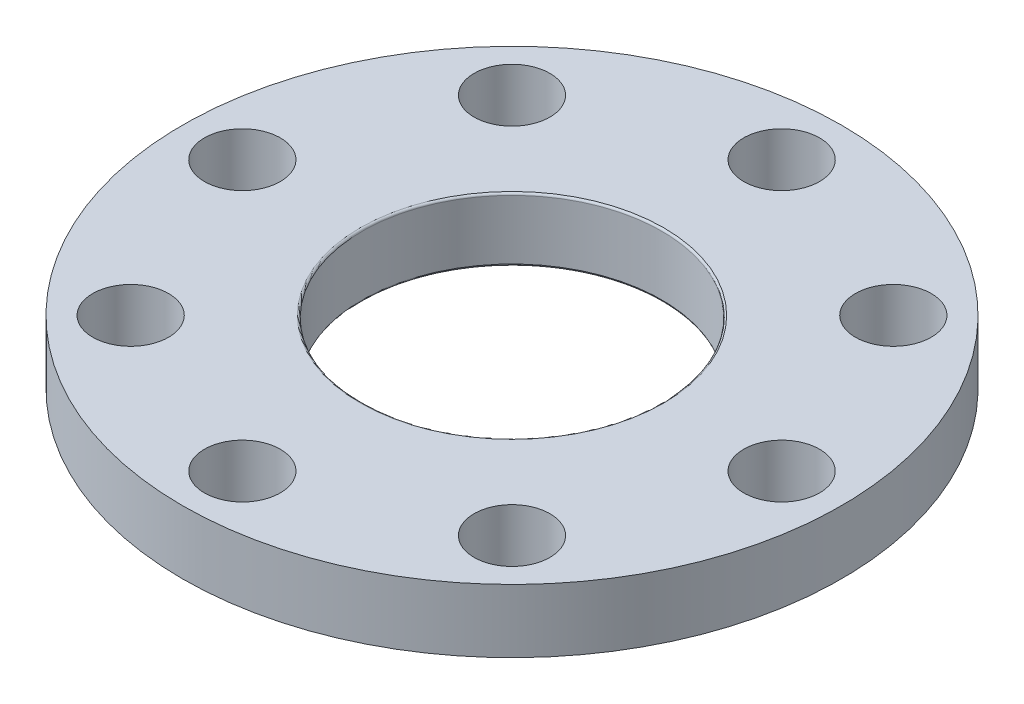
ISO-10303-21;
HEADER;
FILE_DESCRIPTION(('STEP AP214'),'2;1');
FILE_NAME('part.step','',(''),(''),'','','');
FILE_SCHEMA(('AUTOMOTIVE_DESIGN { 1 0 10303 214 1 1 1 1 }'));
ENDSEC;
DATA;
#1=APPLICATION_CONTEXT('core data for automotive mechanical design processes');
#2=APPLICATION_PROTOCOL_DEFINITION('international standard','automotive_design',2000,#1);
#3=PRODUCT_CONTEXT('',#1,'mechanical');
#4=PRODUCT('Part','Part','',(#3));
#5=PRODUCT_RELATED_PRODUCT_CATEGORY('part','',(#4));
#6=PRODUCT_DEFINITION_FORMATION('','',#4);
#7=PRODUCT_DEFINITION_CONTEXT('part definition',#1,'design');
#8=PRODUCT_DEFINITION('design','',#6,#7);
#9=PRODUCT_DEFINITION_SHAPE('','',#8);
#10=(LENGTH_UNIT() NAMED_UNIT(*) SI_UNIT(.MILLI.,.METRE.));
#11=(NAMED_UNIT(*) PLANE_ANGLE_UNIT() SI_UNIT($,.RADIAN.));
#12=(NAMED_UNIT(*) SI_UNIT($,.STERADIAN.) SOLID_ANGLE_UNIT());
#13=UNCERTAINTY_MEASURE_WITH_UNIT(LENGTH_MEASURE(1.E-05),#10,'distance_accuracy_value','');
#14=(GEOMETRIC_REPRESENTATION_CONTEXT(3) GLOBAL_UNCERTAINTY_ASSIGNED_CONTEXT((#13)) GLOBAL_UNIT_ASSIGNED_CONTEXT((#10,
#11,#12)) REPRESENTATION_CONTEXT('',''));
#15=CARTESIAN_POINT('',(0.,0.,0.));
#16=DIRECTION('',(0.,0.,1.));
#17=DIRECTION('',(1.,0.,0.));
#18=AXIS2_PLACEMENT_3D('',#15,#16,#17);
#19=CARTESIAN_POINT('',(0.,3.175,0.));
#20=DIRECTION('',(0.,1.,0.));
#21=DIRECTION('',(0.,0.,1.));
#22=AXIS2_PLACEMENT_3D('',#19,#20,#21);
#23=PLANE('',#22);
#24=CARTESIAN_POINT('',(-9.54594154601828,3.175,-9.54594154601851));
#25=DIRECTION('',(0.,1.,0.));
#26=DIRECTION('',(0.707106781186539,0.,0.707106781186556));
#27=AXIS2_PLACEMENT_3D('',#24,#25,#26);
#28=CIRCLE('',#27,1.89865);
#29=CARTESIAN_POINT('',(-8.20339325591845,3.175,-8.20339325591865));
#30=VERTEX_POINT('',#29);
#31=EDGE_CURVE('E99',#30,#30,#28,.T.);
#32=ORIENTED_EDGE('',*,*,#31,.F.);
#33=EDGE_LOOP('',(#32));
#34=FACE_BOUND('',#33,.T.);
#35=CARTESIAN_POINT('',(-13.5,3.175,-1.41404994223147E-13));
#36=DIRECTION('',(0.,1.,0.));
#37=DIRECTION('',(1.,0.,0.));
#38=AXIS2_PLACEMENT_3D('',#35,#36,#37);
#39=CIRCLE('',#38,1.89865);
#40=CARTESIAN_POINT('',(-11.60135,3.175,-1.21517691091163E-13));
#41=VERTEX_POINT('',#40);
#42=EDGE_CURVE('E93',#41,#41,#39,.T.);
#43=ORIENTED_EDGE('',*,*,#42,.F.);
#44=EDGE_LOOP('',(#43));
#45=FACE_BOUND('',#44,.T.);
#46=CARTESIAN_POINT('',(-9.54594154601847,3.175,9.54594154601831));
#47=DIRECTION('',(0.,1.,0.));
#48=DIRECTION('',(0.707106781186554,0.,-0.707106781186541));
#49=AXIS2_PLACEMENT_3D('',#46,#47,#48);
#50=CIRCLE('',#49,1.89865);
#51=CARTESIAN_POINT('',(-8.20339325591863,3.175,8.20339325591848));
#52=VERTEX_POINT('',#51);
#53=EDGE_CURVE('E87',#52,#52,#50,.T.);
#54=ORIENTED_EDGE('',*,*,#53,.F.);
#55=EDGE_LOOP('',(#54));
#56=FACE_BOUND('',#55,.T.);
#57=CARTESIAN_POINT('',(0.,3.175,13.5));
#58=DIRECTION('',(0.,1.,0.));
#59=DIRECTION('',(0.,0.,-1.));
#60=AXIS2_PLACEMENT_3D('',#57,#58,#59);
#61=CIRCLE('',#60,1.89865);
#62=CARTESIAN_POINT('',(0.,3.175,11.60135));
#63=VERTEX_POINT('',#62);
#64=EDGE_CURVE('E81',#63,#63,#61,.T.);
#65=ORIENTED_EDGE('',*,*,#64,.F.);
#66=EDGE_LOOP('',(#65));
#67=FACE_BOUND('',#66,.T.);
#68=CARTESIAN_POINT('',(9.54594154601834,3.175,9.54594154601844));
#69=DIRECTION('',(0.,1.,0.));
#70=DIRECTION('',(-0.707106781186544,0.,-0.707106781186551));
#71=AXIS2_PLACEMENT_3D('',#68,#69,#70);
#72=CIRCLE('',#71,1.89865);
#73=CARTESIAN_POINT('',(8.20339325591851,3.175,8.20339325591859));
#74=VERTEX_POINT('',#73);
#75=EDGE_CURVE('E75',#74,#74,#72,.T.);
#76=ORIENTED_EDGE('',*,*,#75,.F.);
#77=EDGE_LOOP('',(#76));
#78=FACE_BOUND('',#77,.T.);
#79=CARTESIAN_POINT('',(13.5,3.175,0.));
#80=DIRECTION('',(0.,1.,0.));
#81=DIRECTION('',(-1.,0.,0.));
#82=AXIS2_PLACEMENT_3D('',#79,#80,#81);
#83=CIRCLE('',#82,1.89865);
#84=CARTESIAN_POINT('',(11.60135,3.175,0.));
#85=VERTEX_POINT('',#84);
#86=EDGE_CURVE('E69',#85,#85,#83,.T.);
#87=ORIENTED_EDGE('',*,*,#86,.F.);
#88=EDGE_LOOP('',(#87));
#89=FACE_BOUND('',#88,.T.);
#90=CARTESIAN_POINT('',(9.54594154601841,3.175,-9.54594154601837));
#91=DIRECTION('',(0.,1.,0.));
#92=DIRECTION('',(-0.707106781186549,0.,0.707106781186546));
#93=AXIS2_PLACEMENT_3D('',#90,#91,#92);
#94=CIRCLE('',#93,1.89865);
#95=CARTESIAN_POINT('',(8.20339325591857,3.175,-8.20339325591854));
#96=VERTEX_POINT('',#95);
#97=EDGE_CURVE('E63',#96,#96,#94,.T.);
#98=ORIENTED_EDGE('',*,*,#97,.F.);
#99=EDGE_LOOP('',(#98));
#100=FACE_BOUND('',#99,.T.);
#101=CARTESIAN_POINT('',(0.,3.175,-13.5));
#102=DIRECTION('',(0.,1.,0.));
#103=DIRECTION('',(0.,0.,1.));
#104=AXIS2_PLACEMENT_3D('',#101,#102,#103);
#105=CIRCLE('',#104,1.89865);
#106=CARTESIAN_POINT('',(0.,3.175,-11.60135));
#107=VERTEX_POINT('',#106);
#108=EDGE_CURVE('E57',#107,#107,#105,.T.);
#109=ORIENTED_EDGE('',*,*,#108,.F.);
#110=EDGE_LOOP('',(#109));
#111=FACE_BOUND('',#110,.T.);
#112=CARTESIAN_POINT('',(0.,3.175,0.));
#113=DIRECTION('',(0.,1.,0.));
#114=DIRECTION('',(0.,0.,1.));
#115=AXIS2_PLACEMENT_3D('',#112,#113,#114);
#116=CIRCLE('',#115,7.6);
#117=CARTESIAN_POINT('',(0.,3.175,7.6));
#118=VERTEX_POINT('',#117);
#119=EDGE_CURVE('E10',#118,#118,#116,.F.);
#120=ORIENTED_EDGE('',*,*,#119,.T.);
#121=EDGE_LOOP('',(#120));
#122=FACE_BOUND('',#121,.T.);
#123=CARTESIAN_POINT('',(0.,3.175,0.));
#124=DIRECTION('',(0.,1.,0.));
#125=DIRECTION('',(0.,0.,1.));
#126=AXIS2_PLACEMENT_3D('',#123,#124,#125);
#127=CIRCLE('',#126,16.5);
#128=CARTESIAN_POINT('',(0.,3.175,16.5));
#129=VERTEX_POINT('',#128);
#130=EDGE_CURVE('E50',#129,#129,#127,.T.);
#131=ORIENTED_EDGE('',*,*,#130,.T.);
#132=EDGE_LOOP('',(#131));
#133=FACE_BOUND('',#132,.T.);
#134=ADVANCED_FACE('F30',(#34,#45,#56,#67,#78,#89,#100,#111,#122,#133),#23,.T.);
#135=CARTESIAN_POINT('',(0.,0.,0.));
#136=DIRECTION('',(0.,1.,0.));
#137=DIRECTION('',(0.,0.,1.));
#138=AXIS2_PLACEMENT_3D('',#135,#136,#137);
#139=PLANE('',#138);
#140=CARTESIAN_POINT('',(-9.54594154601828,0.,-9.54594154601851));
#141=DIRECTION('',(0.,1.,0.));
#142=DIRECTION('',(0.707106781186539,0.,0.707106781186556));
#143=AXIS2_PLACEMENT_3D('',#140,#141,#142);
#144=CIRCLE('',#143,1.89865);
#145=CARTESIAN_POINT('',(-8.20339325591845,0.,-8.20339325591865));
#146=VERTEX_POINT('',#145);
#147=EDGE_CURVE('E96',#146,#146,#144,.T.);
#148=ORIENTED_EDGE('',*,*,#147,.T.);
#149=EDGE_LOOP('',(#148));
#150=FACE_BOUND('',#149,.T.);
#151=CARTESIAN_POINT('',(-13.5,0.,-1.41404994223147E-13));
#152=DIRECTION('',(0.,1.,0.));
#153=DIRECTION('',(1.,0.,0.));
#154=AXIS2_PLACEMENT_3D('',#151,#152,#153);
#155=CIRCLE('',#154,1.89865);
#156=CARTESIAN_POINT('',(-11.60135,0.,-1.21517691091163E-13));
#157=VERTEX_POINT('',#156);
#158=EDGE_CURVE('E90',#157,#157,#155,.T.);
#159=ORIENTED_EDGE('',*,*,#158,.T.);
#160=EDGE_LOOP('',(#159));
#161=FACE_BOUND('',#160,.T.);
#162=CARTESIAN_POINT('',(-9.54594154601847,0.,9.54594154601831));
#163=DIRECTION('',(0.,1.,0.));
#164=DIRECTION('',(0.707106781186554,0.,-0.707106781186541));
#165=AXIS2_PLACEMENT_3D('',#162,#163,#164);
#166=CIRCLE('',#165,1.89865);
#167=CARTESIAN_POINT('',(-8.20339325591863,0.,8.20339325591848));
#168=VERTEX_POINT('',#167);
#169=EDGE_CURVE('E84',#168,#168,#166,.T.);
#170=ORIENTED_EDGE('',*,*,#169,.T.);
#171=EDGE_LOOP('',(#170));
#172=FACE_BOUND('',#171,.T.);
#173=CARTESIAN_POINT('',(0.,0.,13.5));
#174=DIRECTION('',(0.,1.,0.));
#175=DIRECTION('',(0.,0.,-1.));
#176=AXIS2_PLACEMENT_3D('',#173,#174,#175);
#177=CIRCLE('',#176,1.89865);
#178=CARTESIAN_POINT('',(0.,0.,11.60135));
#179=VERTEX_POINT('',#178);
#180=EDGE_CURVE('E78',#179,#179,#177,.T.);
#181=ORIENTED_EDGE('',*,*,#180,.T.);
#182=EDGE_LOOP('',(#181));
#183=FACE_BOUND('',#182,.T.);
#184=CARTESIAN_POINT('',(9.54594154601834,0.,9.54594154601844));
#185=DIRECTION('',(0.,1.,0.));
#186=DIRECTION('',(-0.707106781186544,0.,-0.707106781186551));
#187=AXIS2_PLACEMENT_3D('',#184,#185,#186);
#188=CIRCLE('',#187,1.89865);
#189=CARTESIAN_POINT('',(8.20339325591851,0.,8.20339325591859));
#190=VERTEX_POINT('',#189);
#191=EDGE_CURVE('E72',#190,#190,#188,.T.);
#192=ORIENTED_EDGE('',*,*,#191,.T.);
#193=EDGE_LOOP('',(#192));
#194=FACE_BOUND('',#193,.T.);
#195=CARTESIAN_POINT('',(13.5,0.,0.));
#196=DIRECTION('',(0.,1.,0.));
#197=DIRECTION('',(-1.,0.,0.));
#198=AXIS2_PLACEMENT_3D('',#195,#196,#197);
#199=CIRCLE('',#198,1.89865);
#200=CARTESIAN_POINT('',(11.60135,0.,0.));
#201=VERTEX_POINT('',#200);
#202=EDGE_CURVE('E66',#201,#201,#199,.T.);
#203=ORIENTED_EDGE('',*,*,#202,.T.);
#204=EDGE_LOOP('',(#203));
#205=FACE_BOUND('',#204,.T.);
#206=CARTESIAN_POINT('',(9.54594154601841,0.,-9.54594154601837));
#207=DIRECTION('',(0.,1.,0.));
#208=DIRECTION('',(-0.707106781186549,0.,0.707106781186546));
#209=AXIS2_PLACEMENT_3D('',#206,#207,#208);
#210=CIRCLE('',#209,1.89865);
#211=CARTESIAN_POINT('',(8.20339325591857,0.,-8.20339325591854));
#212=VERTEX_POINT('',#211);
#213=EDGE_CURVE('E60',#212,#212,#210,.T.);
#214=ORIENTED_EDGE('',*,*,#213,.T.);
#215=EDGE_LOOP('',(#214));
#216=FACE_BOUND('',#215,.T.);
#217=CARTESIAN_POINT('',(0.,0.,-13.5));
#218=DIRECTION('',(0.,1.,0.));
#219=DIRECTION('',(0.,0.,1.));
#220=AXIS2_PLACEMENT_3D('',#217,#218,#219);
#221=CIRCLE('',#220,1.89865);
#222=CARTESIAN_POINT('',(0.,0.,-11.60135));
#223=VERTEX_POINT('',#222);
#224=EDGE_CURVE('E54',#223,#223,#221,.T.);
#225=ORIENTED_EDGE('',*,*,#224,.T.);
#226=EDGE_LOOP('',(#225));
#227=FACE_BOUND('',#226,.T.);
#228=CARTESIAN_POINT('',(0.,0.,0.));
#229=DIRECTION('',(0.,1.,0.));
#230=DIRECTION('',(0.,0.,1.));
#231=AXIS2_PLACEMENT_3D('',#228,#229,#230);
#232=CIRCLE('',#231,7.6);
#233=CARTESIAN_POINT('',(0.,0.,7.6));
#234=VERTEX_POINT('',#233);
#235=EDGE_CURVE('E45',#234,#234,#232,.T.);
#236=ORIENTED_EDGE('',*,*,#235,.T.);
#237=EDGE_LOOP('',(#236));
#238=FACE_BOUND('',#237,.T.);
#239=CARTESIAN_POINT('',(0.,0.,0.));
#240=DIRECTION('',(0.,1.,0.));
#241=DIRECTION('',(0.,0.,1.));
#242=AXIS2_PLACEMENT_3D('',#239,#240,#241);
#243=CIRCLE('',#242,16.5);
#244=CARTESIAN_POINT('',(0.,0.,16.5));
#245=VERTEX_POINT('',#244);
#246=EDGE_CURVE('E51',#245,#245,#243,.T.);
#247=ORIENTED_EDGE('',*,*,#246,.F.);
#248=EDGE_LOOP('',(#247));
#249=FACE_BOUND('',#248,.T.);
#250=ADVANCED_FACE('F105',(#150,#161,#172,#183,#194,#205,#216,#227,#238,#249),#139,.F.);
#251=CARTESIAN_POINT('',(0.,3.175,0.));
#252=DIRECTION('',(0.,-1.,0.));
#253=DIRECTION('',(0.,0.,-1.));
#254=AXIS2_PLACEMENT_3D('',#251,#252,#253);
#255=CYLINDRICAL_SURFACE('',#254,16.5);
#256=ORIENTED_EDGE('',*,*,#130,.F.);
#257=EDGE_LOOP('',(#256));
#258=FACE_BOUND('',#257,.T.);
#259=ORIENTED_EDGE('',*,*,#246,.T.);
#260=EDGE_LOOP('',(#259));
#261=FACE_BOUND('',#260,.T.);
#262=ADVANCED_FACE('F134',(#258,#261),#255,.T.);
#263=CARTESIAN_POINT('',(0.,3.175,0.));
#264=DIRECTION('',(0.,-1.,0.));
#265=DIRECTION('',(0.,0.,-1.));
#266=AXIS2_PLACEMENT_3D('',#263,#264,#265);
#267=CYLINDRICAL_SURFACE('',#266,7.5);
#268=CARTESIAN_POINT('',(0.,0.0999999999999998,0.));
#269=DIRECTION('',(0.,1.,0.));
#270=DIRECTION('',(0.,0.,1.));
#271=AXIS2_PLACEMENT_3D('',#268,#269,#270);
#272=CIRCLE('',#271,7.5);
#273=CARTESIAN_POINT('',(0.,0.0999999999999998,7.5));
#274=VERTEX_POINT('',#273);
#275=EDGE_CURVE('E37',#274,#274,#272,.F.);
#276=ORIENTED_EDGE('',*,*,#275,.T.);
#277=EDGE_LOOP('',(#276));
#278=FACE_BOUND('',#277,.T.);
#279=CARTESIAN_POINT('',(0.,3.075,0.));
#280=DIRECTION('',(0.,1.,0.));
#281=DIRECTION('',(0.,0.,1.));
#282=AXIS2_PLACEMENT_3D('',#279,#280,#281);
#283=CIRCLE('',#282,7.5);
#284=CARTESIAN_POINT('',(0.,3.075,7.5));
#285=VERTEX_POINT('',#284);
#286=EDGE_CURVE('E41',#285,#285,#283,.T.);
#287=ORIENTED_EDGE('',*,*,#286,.T.);
#288=EDGE_LOOP('',(#287));
#289=FACE_BOUND('',#288,.T.);
#290=ADVANCED_FACE('F137',(#278,#289),#267,.F.);
#291=CARTESIAN_POINT('',(0.,0.0999999999999998,0.));
#292=DIRECTION('',(0.,1.,0.));
#293=DIRECTION('',(0.,0.,1.));
#294=AXIS2_PLACEMENT_3D('',#291,#292,#293);
#295=TOROIDAL_SURFACE('',#294,7.6,0.1);
#296=ORIENTED_EDGE('',*,*,#275,.F.);
#297=EDGE_LOOP('',(#296));
#298=FACE_BOUND('',#297,.T.);
#299=ORIENTED_EDGE('',*,*,#235,.F.);
#300=EDGE_LOOP('',(#299));
#301=FACE_BOUND('',#300,.T.);
#302=ADVANCED_FACE('F146',(#298,#301),#295,.T.);
#303=CARTESIAN_POINT('',(0.,3.075,0.));
#304=DIRECTION('',(0.,1.,0.));
#305=DIRECTION('',(0.,0.,1.));
#306=AXIS2_PLACEMENT_3D('',#303,#304,#305);
#307=TOROIDAL_SURFACE('',#306,7.6,0.1);
#308=ORIENTED_EDGE('',*,*,#119,.F.);
#309=EDGE_LOOP('',(#308));
#310=FACE_BOUND('',#309,.T.);
#311=ORIENTED_EDGE('',*,*,#286,.F.);
#312=EDGE_LOOP('',(#311));
#313=FACE_BOUND('',#312,.T.);
#314=ADVANCED_FACE('F32',(#310,#313),#307,.T.);
#315=CARTESIAN_POINT('',(0.,0.,-13.5));
#316=DIRECTION('',(0.,1.,0.));
#317=DIRECTION('',(0.,0.,1.));
#318=AXIS2_PLACEMENT_3D('',#315,#316,#317);
#319=CYLINDRICAL_SURFACE('',#318,1.89865);
#320=ORIENTED_EDGE('',*,*,#224,.F.);
#321=EDGE_LOOP('',(#320));
#322=FACE_BOUND('',#321,.T.);
#323=ORIENTED_EDGE('',*,*,#108,.T.);
#324=EDGE_LOOP('',(#323));
#325=FACE_BOUND('',#324,.T.);
#326=ADVANCED_FACE('F153',(#322,#325),#319,.F.);
#327=CARTESIAN_POINT('',(9.54594154601841,0.,-9.54594154601837));
#328=DIRECTION('',(0.,1.,0.));
#329=DIRECTION('',(0.,0.,1.));
#330=AXIS2_PLACEMENT_3D('',#327,#328,#329);
#331=CYLINDRICAL_SURFACE('',#330,1.89865);
#332=ORIENTED_EDGE('',*,*,#213,.F.);
#333=EDGE_LOOP('',(#332));
#334=FACE_BOUND('',#333,.T.);
#335=ORIENTED_EDGE('',*,*,#97,.T.);
#336=EDGE_LOOP('',(#335));
#337=FACE_BOUND('',#336,.T.);
#338=ADVANCED_FACE('F164',(#334,#337),#331,.F.);
#339=CARTESIAN_POINT('',(13.5,0.,0.));
#340=DIRECTION('',(0.,1.,0.));
#341=DIRECTION('',(0.,0.,1.));
#342=AXIS2_PLACEMENT_3D('',#339,#340,#341);
#343=CYLINDRICAL_SURFACE('',#342,1.89865);
#344=ORIENTED_EDGE('',*,*,#202,.F.);
#345=EDGE_LOOP('',(#344));
#346=FACE_BOUND('',#345,.T.);
#347=ORIENTED_EDGE('',*,*,#86,.T.);
#348=EDGE_LOOP('',(#347));
#349=FACE_BOUND('',#348,.T.);
#350=ADVANCED_FACE('F168',(#346,#349),#343,.F.);
#351=CARTESIAN_POINT('',(9.54594154601834,0.,9.54594154601844));
#352=DIRECTION('',(0.,1.,0.));
#353=DIRECTION('',(0.,0.,1.));
#354=AXIS2_PLACEMENT_3D('',#351,#352,#353);
#355=CYLINDRICAL_SURFACE('',#354,1.89865);
#356=ORIENTED_EDGE('',*,*,#191,.F.);
#357=EDGE_LOOP('',(#356));
#358=FACE_BOUND('',#357,.T.);
#359=ORIENTED_EDGE('',*,*,#75,.T.);
#360=EDGE_LOOP('',(#359));
#361=FACE_BOUND('',#360,.T.);
#362=ADVANCED_FACE('F172',(#358,#361),#355,.F.);
#363=CARTESIAN_POINT('',(0.,0.,13.5));
#364=DIRECTION('',(0.,1.,0.));
#365=DIRECTION('',(0.,0.,1.));
#366=AXIS2_PLACEMENT_3D('',#363,#364,#365);
#367=CYLINDRICAL_SURFACE('',#366,1.89865);
#368=ORIENTED_EDGE('',*,*,#180,.F.);
#369=EDGE_LOOP('',(#368));
#370=FACE_BOUND('',#369,.T.);
#371=ORIENTED_EDGE('',*,*,#64,.T.);
#372=EDGE_LOOP('',(#371));
#373=FACE_BOUND('',#372,.T.);
#374=ADVANCED_FACE('F176',(#370,#373),#367,.F.);
#375=CARTESIAN_POINT('',(-9.54594154601847,0.,9.54594154601831));
#376=DIRECTION('',(0.,1.,0.));
#377=DIRECTION('',(0.,0.,1.));
#378=AXIS2_PLACEMENT_3D('',#375,#376,#377);
#379=CYLINDRICAL_SURFACE('',#378,1.89865);
#380=ORIENTED_EDGE('',*,*,#169,.F.);
#381=EDGE_LOOP('',(#380));
#382=FACE_BOUND('',#381,.T.);
#383=ORIENTED_EDGE('',*,*,#53,.T.);
#384=EDGE_LOOP('',(#383));
#385=FACE_BOUND('',#384,.T.);
#386=ADVANCED_FACE('F180',(#382,#385),#379,.F.);
#387=CARTESIAN_POINT('',(-13.5,0.,-1.41404994223147E-13));
#388=DIRECTION('',(0.,1.,0.));
#389=DIRECTION('',(0.,0.,1.));
#390=AXIS2_PLACEMENT_3D('',#387,#388,#389);
#391=CYLINDRICAL_SURFACE('',#390,1.89865);
#392=ORIENTED_EDGE('',*,*,#158,.F.);
#393=EDGE_LOOP('',(#392));
#394=FACE_BOUND('',#393,.T.);
#395=ORIENTED_EDGE('',*,*,#42,.T.);
#396=EDGE_LOOP('',(#395));
#397=FACE_BOUND('',#396,.T.);
#398=ADVANCED_FACE('F111',(#394,#397),#391,.F.);
#399=CARTESIAN_POINT('',(-9.54594154601828,0.,-9.54594154601851));
#400=DIRECTION('',(0.,1.,0.));
#401=DIRECTION('',(0.,0.,1.));
#402=AXIS2_PLACEMENT_3D('',#399,#400,#401);
#403=CYLINDRICAL_SURFACE('',#402,1.89865);
#404=ORIENTED_EDGE('',*,*,#147,.F.);
#405=EDGE_LOOP('',(#404));
#406=FACE_BOUND('',#405,.T.);
#407=ORIENTED_EDGE('',*,*,#31,.T.);
#408=EDGE_LOOP('',(#407));
#409=FACE_BOUND('',#408,.T.);
#410=ADVANCED_FACE('F108',(#406,#409),#403,.F.);
#411=CLOSED_SHELL('',(#134,#250,#262,#290,#302,#314,#326,#338,#350,#362,#374,#386,#398,#410));
#412=MANIFOLD_SOLID_BREP('B2',#411);
#413=ADVANCED_BREP_SHAPE_REPRESENTATION('',(#18,#412),#14);
#414=SHAPE_DEFINITION_REPRESENTATION(#9,#413);
ENDSEC;
END-ISO-10303-21;
